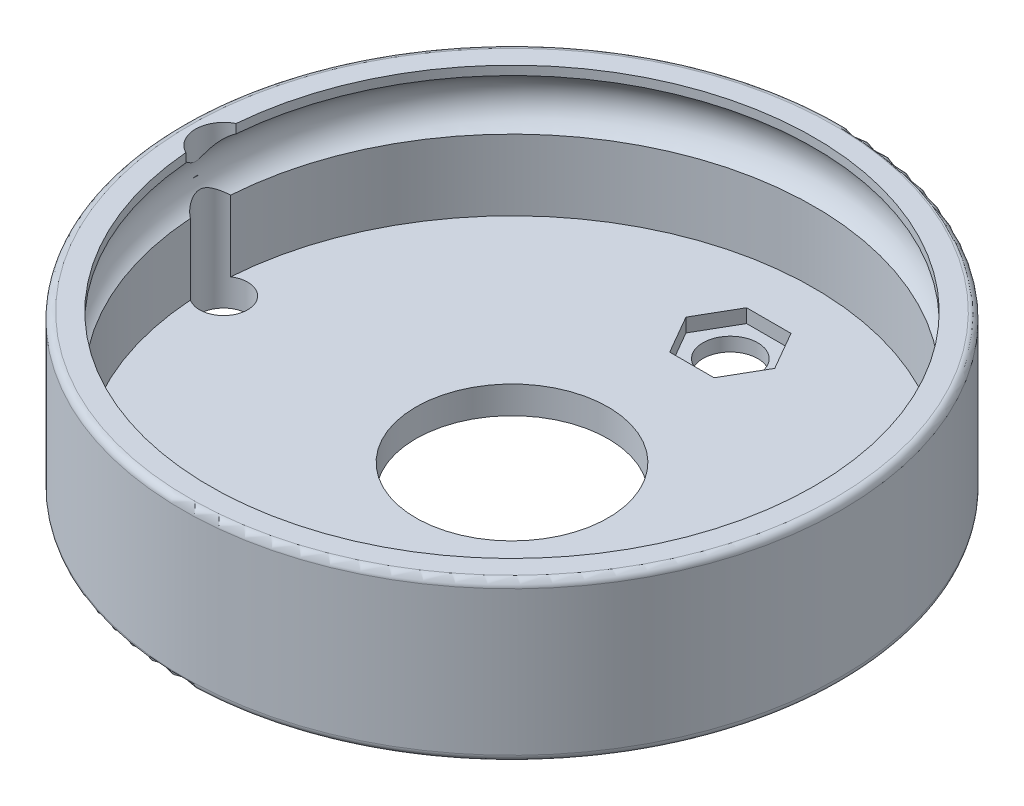
ISO-10303-21;
HEADER;
FILE_DESCRIPTION(('STEP AP214'),'2;1');
FILE_NAME('part.step','',(''),(''),'','','');
FILE_SCHEMA(('AUTOMOTIVE_DESIGN { 1 0 10303 214 1 1 1 1 }'));
ENDSEC;
DATA;
#1=APPLICATION_CONTEXT('core data for automotive mechanical design processes');
#2=APPLICATION_PROTOCOL_DEFINITION('international standard','automotive_design',2000,#1);
#3=PRODUCT_CONTEXT('',#1,'mechanical');
#4=PRODUCT('Part','Part','',(#3));
#5=PRODUCT_RELATED_PRODUCT_CATEGORY('part','',(#4));
#6=PRODUCT_DEFINITION_FORMATION('','',#4);
#7=PRODUCT_DEFINITION_CONTEXT('part definition',#1,'design');
#8=PRODUCT_DEFINITION('design','',#6,#7);
#9=PRODUCT_DEFINITION_SHAPE('','',#8);
#10=(LENGTH_UNIT() NAMED_UNIT(*) SI_UNIT(.MILLI.,.METRE.));
#11=(NAMED_UNIT(*) PLANE_ANGLE_UNIT() SI_UNIT($,.RADIAN.));
#12=(NAMED_UNIT(*) SI_UNIT($,.STERADIAN.) SOLID_ANGLE_UNIT());
#13=UNCERTAINTY_MEASURE_WITH_UNIT(LENGTH_MEASURE(1.E-05),#10,'distance_accuracy_value','');
#14=(GEOMETRIC_REPRESENTATION_CONTEXT(3) GLOBAL_UNCERTAINTY_ASSIGNED_CONTEXT((#13)) GLOBAL_UNIT_ASSIGNED_CONTEXT((#10,
#11,#12)) REPRESENTATION_CONTEXT('',''));
#15=CARTESIAN_POINT('',(0.,0.,0.));
#16=DIRECTION('',(0.,0.,1.));
#17=DIRECTION('',(1.,0.,0.));
#18=AXIS2_PLACEMENT_3D('',#15,#16,#17);
#19=CARTESIAN_POINT('',(0.,2.,0.));
#20=DIRECTION('',(0.,-1.,0.));
#21=DIRECTION('',(1.,0.,0.));
#22=AXIS2_PLACEMENT_3D('',#19,#20,#21);
#23=PLANE('',#22);
#24=CARTESIAN_POINT('',(0.,2.,0.));
#25=DIRECTION('',(0.,1.,0.));
#26=DIRECTION('',(-1.,0.,0.));
#27=AXIS2_PLACEMENT_3D('',#24,#25,#26);
#28=CIRCLE('',#27,7.);
#29=CARTESIAN_POINT('',(-7.,2.,0.));
#30=VERTEX_POINT('',#29);
#31=EDGE_CURVE('E326',#30,#30,#28,.T.);
#32=ORIENTED_EDGE('',*,*,#31,.F.);
#33=EDGE_LOOP('',(#32));
#34=FACE_BOUND('',#33,.T.);
#35=CARTESIAN_POINT('',(-21.,2.,0.));
#36=DIRECTION('',(0.,-1.,0.));
#37=DIRECTION('',(1.,0.,0.));
#38=AXIS2_PLACEMENT_3D('',#35,#36,#37);
#39=CIRCLE('',#38,1.75);
#40=CARTESIAN_POINT('',(-21.9508928571429,2.,1.46911632426934));
#41=VERTEX_POINT('',#40);
#42=CARTESIAN_POINT('',(-21.9508928571429,2.,-1.46911632426934));
#43=VERTEX_POINT('',#42);
#44=EDGE_CURVE('E263',#41,#43,#39,.F.);
#45=ORIENTED_EDGE('',*,*,#44,.F.);
#46=CARTESIAN_POINT('',(0.,2.,0.));
#47=DIRECTION('',(0.,1.,0.));
#48=DIRECTION('',(-1.,0.,0.));
#49=AXIS2_PLACEMENT_3D('',#46,#47,#48);
#50=CIRCLE('',#49,22.);
#51=EDGE_CURVE('E329',#41,#43,#50,.T.);
#52=ORIENTED_EDGE('',*,*,#51,.T.);
#53=EDGE_LOOP('',(#45,#52));
#54=FACE_BOUND('',#53,.T.);
#55=DIRECTION('',(-1.,0.,0.));
#56=VECTOR('',#55,1.);
#57=CARTESIAN_POINT('',(2.01658075373095,2.,12.7));
#58=LINE('',#57,#56);
#59=CARTESIAN_POINT('',(2.01658075373095,2.,12.7));
#60=VERTEX_POINT('',#59);
#61=CARTESIAN_POINT('',(-1.21658075373095,2.,12.7));
#62=VERTEX_POINT('',#61);
#63=EDGE_CURVE('E241',#60,#62,#58,.T.);
#64=ORIENTED_EDGE('',*,*,#63,.F.);
#65=DIRECTION('',(-0.500000000000001,0.,-0.866025403784438));
#66=VECTOR('',#65,1.);
#67=CARTESIAN_POINT('',(3.6331615074619,2.,15.5));
#68=LINE('',#67,#66);
#69=CARTESIAN_POINT('',(3.6331615074619,2.,15.5));
#70=VERTEX_POINT('',#69);
#71=EDGE_CURVE('E61',#70,#60,#68,.T.);
#72=ORIENTED_EDGE('',*,*,#71,.F.);
#73=DIRECTION('',(0.499999999999999,0.,-0.866025403784439));
#74=VECTOR('',#73,1.);
#75=CARTESIAN_POINT('',(2.01658075373095,2.,18.3));
#76=LINE('',#75,#74);
#77=CARTESIAN_POINT('',(2.01658075373095,2.,18.3));
#78=VERTEX_POINT('',#77);
#79=EDGE_CURVE('E228',#78,#70,#76,.T.);
#80=ORIENTED_EDGE('',*,*,#79,.F.);
#81=DIRECTION('',(1.,0.,0.));
#82=VECTOR('',#81,1.);
#83=CARTESIAN_POINT('',(-1.21658075373095,2.,18.3));
#84=LINE('',#83,#82);
#85=CARTESIAN_POINT('',(-1.21658075373095,2.,18.3));
#86=VERTEX_POINT('',#85);
#87=EDGE_CURVE('E231',#86,#78,#84,.T.);
#88=ORIENTED_EDGE('',*,*,#87,.F.);
#89=DIRECTION('',(0.5,0.,0.866025403784439));
#90=VECTOR('',#89,1.);
#91=CARTESIAN_POINT('',(-2.8331615074619,2.,15.5));
#92=LINE('',#91,#90);
#93=CARTESIAN_POINT('',(-2.8331615074619,2.,15.5));
#94=VERTEX_POINT('',#93);
#95=EDGE_CURVE('E235',#94,#86,#92,.T.);
#96=ORIENTED_EDGE('',*,*,#95,.F.);
#97=DIRECTION('',(-0.5,0.,0.866025403784439));
#98=VECTOR('',#97,1.);
#99=CARTESIAN_POINT('',(-1.21658075373095,2.,12.7));
#100=LINE('',#99,#98);
#101=EDGE_CURVE('E238',#62,#94,#100,.T.);
#102=ORIENTED_EDGE('',*,*,#101,.F.);
#103=EDGE_LOOP('',(#64,#72,#80,#88,#96,#102));
#104=FACE_BOUND('',#103,.T.);
#105=DIRECTION('',(0.5,0.,-0.866025403784439));
#106=VECTOR('',#105,1.);
#107=CARTESIAN_POINT('',(-8.83656800992583,2.,-5.10179491924311));
#108=LINE('',#107,#106);
#109=CARTESIAN_POINT('',(-2.8331615074619,2.,-15.5));
#110=VERTEX_POINT('',#109);
#111=CARTESIAN_POINT('',(-1.21658075373096,2.,-18.3));
#112=VERTEX_POINT('',#111);
#113=EDGE_CURVE('E53',#110,#112,#108,.T.);
#114=ORIENTED_EDGE('',*,*,#113,.T.);
#115=DIRECTION('',(1.,0.,0.));
#116=VECTOR('',#115,1.);
#117=CARTESIAN_POINT('',(0.,2.,-18.3));
#118=LINE('',#117,#116);
#119=CARTESIAN_POINT('',(2.01658075373094,2.,-18.3));
#120=VERTEX_POINT('',#119);
#121=EDGE_CURVE('E178',#112,#120,#118,.T.);
#122=ORIENTED_EDGE('',*,*,#121,.T.);
#123=DIRECTION('',(0.499999999999999,0.,0.866025403784439));
#124=VECTOR('',#123,1.);
#125=CARTESIAN_POINT('',(9.43656800992581,2.,-5.44820508075686));
#126=LINE('',#125,#124);
#127=CARTESIAN_POINT('',(3.63316150746189,2.,-15.5));
#128=VERTEX_POINT('',#127);
#129=EDGE_CURVE('E181',#120,#128,#126,.T.);
#130=ORIENTED_EDGE('',*,*,#129,.T.);
#131=DIRECTION('',(-0.5,0.,0.866025403784438));
#132=VECTOR('',#131,1.);
#133=CARTESIAN_POINT('',(-3.98682574873298,2.,-2.30179491924312));
#134=LINE('',#133,#132);
#135=CARTESIAN_POINT('',(2.01658075373095,2.,-12.7));
#136=VERTEX_POINT('',#135);
#137=EDGE_CURVE('E199',#128,#136,#134,.T.);
#138=ORIENTED_EDGE('',*,*,#137,.T.);
#139=DIRECTION('',(-1.,0.,0.));
#140=VECTOR('',#139,1.);
#141=CARTESIAN_POINT('',(0.,2.,-12.7));
#142=LINE('',#141,#140);
#143=CARTESIAN_POINT('',(-1.21658075373096,2.,-12.7));
#144=VERTEX_POINT('',#143);
#145=EDGE_CURVE('E196',#136,#144,#142,.T.);
#146=ORIENTED_EDGE('',*,*,#145,.T.);
#147=DIRECTION('',(-0.5,0.,-0.866025403784439));
#148=VECTOR('',#147,1.);
#149=CARTESIAN_POINT('',(4.58682574873297,2.,-2.64820508075688));
#150=LINE('',#149,#148);
#151=EDGE_CURVE('E194',#144,#110,#150,.T.);
#152=ORIENTED_EDGE('',*,*,#151,.T.);
#153=EDGE_LOOP('',(#114,#122,#130,#138,#146,#152));
#154=FACE_BOUND('',#153,.T.);
#155=ADVANCED_FACE('F38',(#34,#54,#104,#154),#23,.F.);
#156=CARTESIAN_POINT('',(0.,9.,0.));
#157=DIRECTION('',(0.,1.,0.));
#158=DIRECTION('',(-1.,0.,0.));
#159=AXIS2_PLACEMENT_3D('',#156,#157,#158);
#160=TOROIDAL_SURFACE('',#159,21.,2.1);
#161=CARTESIAN_POINT('',(-21.9233630002656,10.8468185312619,1.83027341393041));
#162=CARTESIAN_POINT('',(-21.9802905930155,10.8173965792043,1.80154549591476));
#163=CARTESIAN_POINT('',(-22.0350337016278,10.786129071464,1.77060499340374));
#164=CARTESIAN_POINT('',(-22.1400448430575,10.7205179132911,1.70488537685474));
#165=CARTESIAN_POINT('',(-22.1903204800144,10.6861796975606,1.67011302024804));
#166=CARTESIAN_POINT('',(-22.3340899190673,10.5796715528945,1.56112834909355));
#167=CARTESIAN_POINT('',(-22.4210962946064,10.5037021805993,1.48194995352091));
#168=CARTESIAN_POINT('',(-22.5484185919964,10.3752638251822,1.34538613057545));
#169=CARTESIAN_POINT('',(-22.5940090021654,10.3246638746398,1.29096110141001));
#170=CARTESIAN_POINT('',(-22.6787077466035,10.2217469243954,1.1787200687557));
#171=CARTESIAN_POINT('',(-22.717814159397,10.1694294211947,1.12090306693301));
#172=CARTESIAN_POINT('',(-22.7896847254728,10.0639039080598,1.00217290409094));
#173=CARTESIAN_POINT('',(-22.8224448997058,10.0106953620132,0.941257830622505));
#174=CARTESIAN_POINT('',(-22.8817112586453,9.90445677133678,0.816361907741159));
#175=CARTESIAN_POINT('',(-22.9082214409061,9.85142663411066,0.752383049636678));
#176=CARTESIAN_POINT('',(-22.9484987791132,9.76187435482978,0.639052255607793));
#177=CARTESIAN_POINT('',(-22.9637574587035,9.72487568671589,0.590601657406404));
#178=CARTESIAN_POINT('',(-22.9909917432374,9.65321248781145,0.491044655936095));
#179=CARTESIAN_POINT('',(-23.0029677789383,9.61854765122004,0.439938602171168));
#180=CARTESIAN_POINT('',(-23.020169949025,9.56460305261898,0.350410956289943));
#181=CARTESIAN_POINT('',(-23.0263350376975,9.54390791032266,0.313038353690529));
#182=CARTESIAN_POINT('',(-23.0367627938324,9.50711782183637,0.23581139547886));
#183=CARTESIAN_POINT('',(-23.0410307410837,9.49101015412112,0.195964283712251));
#184=CARTESIAN_POINT('',(-23.0462767817496,9.47060922692398,0.126666616592287));
#185=CARTESIAN_POINT('',(-23.0478685231943,9.46419041594388,0.0979155943241878));
#186=CARTESIAN_POINT('',(-23.0498198947946,9.45627963759212,0.0397421577159311));
#187=CARTESIAN_POINT('',(-23.0501831138601,9.45477331970703,0.010321952221163));
#188=CARTESIAN_POINT('',(-23.049640892952,9.45699132649809,-0.0483103087178413));
#189=CARTESIAN_POINT('',(-23.0487347779031,9.460718434492,-0.07752224509095));
#190=CARTESIAN_POINT('',(-23.0457535695919,9.47263734860213,-0.134998790748412));
#191=CARTESIAN_POINT('',(-23.0436747832657,9.48084325702844,-0.163260106857022));
#192=CARTESIAN_POINT('',(-23.0352056382934,9.51292383591861,-0.253898956134554));
#193=CARTESIAN_POINT('',(-23.0267029159511,9.54340697445668,-0.313620524036974));
#194=CARTESIAN_POINT('',(-23.0055704975357,9.61092980844803,-0.428519202575009));
#195=CARTESIAN_POINT('',(-22.9929083541111,9.64801996853784,-0.483656168808446));
#196=CARTESIAN_POINT('',(-22.9625640362926,9.72816850005715,-0.595350885118018));
#197=CARTESIAN_POINT('',(-22.9445534939284,9.77146678277515,-0.651649532030225));
#198=CARTESIAN_POINT('',(-22.9041500414674,9.85929100639993,-0.761673181413656));
#199=CARTESIAN_POINT('',(-22.8817533489583,9.90381797819585,-0.815395912403044));
#200=CARTESIAN_POINT('',(-22.8080659066111,10.0374370931439,-0.973066586352874));
#201=CARTESIAN_POINT('',(-22.7501931300971,10.1268048550729,-1.07382247454019));
#202=CARTESIAN_POINT('',(-22.6158151146606,10.3021909095783,-1.26711515351839));
#203=CARTESIAN_POINT('',(-22.5391715930528,10.3881785793459,-1.35958364923651));
#204=CARTESIAN_POINT('',(-22.366756748061,10.5522523471373,-1.53274774502226));
#205=CARTESIAN_POINT('',(-22.2710481918497,10.6303631392939,-1.61348051203911));
#206=CARTESIAN_POINT('',(-22.1278504297184,10.7280989308558,-1.7124770744131));
#207=CARTESIAN_POINT('',(-22.0887001824058,10.7531622668679,-1.73765445564527));
#208=CARTESIAN_POINT('',(-22.0078995258777,10.8014423122098,-1.7857344901196));
#209=CARTESIAN_POINT('',(-21.9662474292924,10.8246577501221,-1.80863557984394));
#210=CARTESIAN_POINT('',(-21.9233630002656,10.8468185312619,-1.83027341393041));
#211=B_SPLINE_CURVE_WITH_KNOTS('',3,(#161,#162,#163,#164,#165,#166,#167,#168,#169,#170,#171,
#172,#173,#174,#175,#176,#177,#178,#179,#180,#181,#182,#183,#184,#185,#186,#187,#188,#189,#190,
#191,#192,#193,#194,#195,#196,#197,#198,#199,#200,#201,#202,#203,#204,#205,#206,#207,#208,#209,
#210),.UNSPECIFIED.,.F.,.F.,(4,2,2,2,2,2,2,2,2,2,2,2,2,2,2,2,2,2,2,2,2,2,2,2,4),(0.,
0.210433453676087,0.420501575870549,0.838530643225176,1.09981772360362,1.36118209625276,
1.62270981595776,1.88406980345896,2.0724846801652,2.26087482071537,2.39017789810222,
2.51911883384929,2.60726328722764,2.6951500188056,2.78308350930926,2.87129548505103,
3.07246810450563,3.27524888184137,3.49478656680868,3.71451441121011,4.15279116734951,
4.59439928856464,5.0345768577585,5.19305785927877,5.35164697522814),.UNSPECIFIED.);
#212=CARTESIAN_POINT('',(-21.92375,10.8466185312619,1.83007812333244));
#213=VERTEX_POINT('',#212);
#214=CARTESIAN_POINT('',(-21.92375,10.8466185312619,-1.83007812333244));
#215=VERTEX_POINT('',#214);
#216=EDGE_CURVE('E306',#213,#215,#211,.T.);
#217=ORIENTED_EDGE('',*,*,#216,.F.);
#218=CARTESIAN_POINT('',(0.,10.8466185312619,0.));
#219=DIRECTION('',(0.,1.,0.));
#220=DIRECTION('',(-1.,0.,0.));
#221=AXIS2_PLACEMENT_3D('',#218,#219,#220);
#222=CIRCLE('',#221,22.);
#223=EDGE_CURVE('E317',#213,#215,#222,.T.);
#224=ORIENTED_EDGE('',*,*,#223,.T.);
#225=EDGE_LOOP('',(#217,#224));
#226=FACE_BOUND('',#225,.T.);
#227=CARTESIAN_POINT('',(-23.0385420983889,8.49979999999999,-0.216439629218027));
#228=CARTESIAN_POINT('',(-23.0417081023825,8.51160340613661,-0.186822190556957));
#229=CARTESIAN_POINT('',(-23.044286108454,8.52160098226851,-0.15619339901227));
#230=CARTESIAN_POINT('',(-23.0480802734292,8.53660054066823,-0.0938819804006893));
#231=CARTESIAN_POINT('',(-23.049304529016,8.54163220402275,-0.0622067986494039));
#232=CARTESIAN_POINT('',(-23.050252950515,8.5455119451354,0.00196899982279068));
#233=CARTESIAN_POINT('',(-23.049959771228,8.54428852543972,0.0344749156453112));
#234=CARTESIAN_POINT('',(-23.0478803078503,8.53585679721273,0.0985915571549284));
#235=CARTESIAN_POINT('',(-23.0460940403857,8.52864855532438,0.130202292806097));
#236=CARTESIAN_POINT('',(-23.0429265900018,8.51637585795821,0.170412356482081));
#237=CARTESIAN_POINT('',(-23.0421273835151,8.51330587899395,0.179728802027053));
#238=CARTESIAN_POINT('',(-23.0404173233971,8.50680992100783,0.198198068062205));
#239=CARTESIAN_POINT('',(-23.039506778443,8.50338493007581,0.207351263793174));
#240=CARTESIAN_POINT('',(-23.03854209839,8.49979999998293,0.216439629213118));
#241=B_SPLINE_CURVE_WITH_KNOTS('',3,(#227,#228,#229,#230,#231,#232,#233,#234,#235,#236,#237,
#238,#239,#240),.UNSPECIFIED.,.F.,.F.,(4,2,2,2,2,2,4),(0.,0.0963837900762367,0.19218794426013,
0.289089599533549,0.385990175789691,0.41551229305359,0.444954343313652),.UNSPECIFIED.);
#242=CARTESIAN_POINT('',(-23.0385959006752,8.5,-0.215932289735066));
#243=VERTEX_POINT('',#242);
#244=CARTESIAN_POINT('',(-23.0385959006752,8.5,0.215932289735066));
#245=VERTEX_POINT('',#244);
#246=EDGE_CURVE('E311',#243,#245,#241,.T.);
#247=ORIENTED_EDGE('',*,*,#246,.F.);
#248=CARTESIAN_POINT('',(0.,8.5,0.));
#249=DIRECTION('',(0.,1.,0.));
#250=DIRECTION('',(-1.,0.,0.));
#251=AXIS2_PLACEMENT_3D('',#248,#249,#250);
#252=CIRCLE('',#251,23.0396078054371);
#253=EDGE_CURVE('E11',#243,#245,#252,.T.);
#254=ORIENTED_EDGE('',*,*,#253,.T.);
#255=EDGE_LOOP('',(#247,#254));
#256=FACE_BOUND('',#255,.T.);
#257=CARTESIAN_POINT('',(0.,7.15338146873806,0.));
#258=DIRECTION('',(0.,1.,0.));
#259=DIRECTION('',(-1.,0.,0.));
#260=AXIS2_PLACEMENT_3D('',#257,#258,#259);
#261=CIRCLE('',#260,22.);
#262=CARTESIAN_POINT('',(-21.9508928571429,7.15338146873806,1.46911632426935));
#263=VERTEX_POINT('',#262);
#264=CARTESIAN_POINT('',(-21.9508928571429,7.15338146873806,-1.46911632426936));
#265=VERTEX_POINT('',#264);
#266=EDGE_CURVE('E332',#263,#265,#261,.T.);
#267=ORIENTED_EDGE('',*,*,#266,.F.);
#268=CARTESIAN_POINT('',(-21.6852629879099,7.03657806675995,1.61025297310727));
#269=CARTESIAN_POINT('',(-21.7322227360092,7.05378503974938,1.59026605983212));
#270=CARTESIAN_POINT('',(-21.7778660342877,7.07225370096692,1.56841887729176));
#271=CARTESIAN_POINT('',(-21.8663126193497,7.11126250165387,1.52135078401042));
#272=CARTESIAN_POINT('',(-21.9091216492499,7.13179822549066,1.49613702877458));
#273=CARTESIAN_POINT('',(-22.0426961951101,7.20081626722394,1.40973138283353));
#274=CARTESIAN_POINT('',(-22.1278158387662,7.25265689039355,1.34237170819555));
#275=CARTESIAN_POINT('',(-22.2835237733971,7.36044643245431,1.19444560110274));
#276=CARTESIAN_POINT('',(-22.3540260105094,7.41641718855257,1.1138057099599));
#277=CARTESIAN_POINT('',(-22.4482125341289,7.4994775174254,0.983889597282091));
#278=CARTESIAN_POINT('',(-22.4777082257626,7.52704704085949,0.93903318825795));
#279=CARTESIAN_POINT('',(-22.5327307764518,7.58108254591007,0.846255868942823));
#280=CARTESIAN_POINT('',(-22.5582557366805,7.60754799515184,0.798333507860034));
#281=CARTESIAN_POINT('',(-22.6049886586016,7.65819724200511,0.699626764281206));
#282=CARTESIAN_POINT('',(-22.6262179452373,7.68239197386449,0.648858201557964));
#283=CARTESIAN_POINT('',(-22.6641546000458,7.72727885687801,0.544225417408166));
#284=CARTESIAN_POINT('',(-22.6808679228295,7.74797560673612,0.490365387105524));
#285=CARTESIAN_POINT('',(-22.7098351753462,7.7848781722514,0.377469205073467));
#286=CARTESIAN_POINT('',(-22.7218942362695,7.80088209376438,0.318313895965427));
#287=CARTESIAN_POINT('',(-22.7398741902099,7.82511617492679,0.197592522727287));
#288=CARTESIAN_POINT('',(-22.7458098705188,7.83336505784625,0.136032640635567));
#289=CARTESIAN_POINT('',(-22.7510713027194,7.8406631393095,0.0116904333694072));
#290=CARTESIAN_POINT('',(-22.7503585618898,7.83965876418114,-0.0510969077076101));
#291=CARTESIAN_POINT('',(-22.7423016186504,7.82852131839549,-0.175453094353484));
#292=CARTESIAN_POINT('',(-22.7349475240028,7.8183746303957,-0.237019982225484));
#293=CARTESIAN_POINT('',(-22.7113948584838,7.78695234362383,-0.373719998655487));
#294=CARTESIAN_POINT('',(-22.6933349070776,7.76340064194923,-0.447989132816512));
#295=CARTESIAN_POINT('',(-22.6488576228345,7.70874868294878,-0.591120725345172));
#296=CARTESIAN_POINT('',(-22.6224110329418,7.67762209015054,-0.659963186708978));
#297=CARTESIAN_POINT('',(-22.5472125936172,7.59497251083096,-0.824889736175925));
#298=CARTESIAN_POINT('',(-22.4938954011259,7.54096845540915,-0.917636108890399));
#299=CARTESIAN_POINT('',(-22.3721622074226,7.43148808663654,-1.09127251775508));
#300=CARTESIAN_POINT('',(-22.3037685966336,7.37601406275255,-1.17217984301586));
#301=CARTESIAN_POINT('',(-22.1862358192794,7.29255137435599,-1.28793473147685));
#302=CARTESIAN_POINT('',(-22.142198556918,7.26338366871421,-1.32717800021164));
#303=CARTESIAN_POINT('',(-22.0496684334007,7.20678804736724,-1.40150650056109));
#304=CARTESIAN_POINT('',(-22.001174135829,7.17936069739284,-1.43659038328575));
#305=CARTESIAN_POINT('',(-21.8803037669477,7.11690953222264,-1.51477915118743));
#306=CARTESIAN_POINT('',(-21.805928338998,7.08303358346247,-1.55576186103222));
#307=CARTESIAN_POINT('',(-21.6496763848512,7.02225745180524,-1.62719509841536));
#308=CARTESIAN_POINT('',(-21.5678134219198,6.99534498086434,-1.65766421083391));
#309=CARTESIAN_POINT('',(-21.444817431575,6.96288757839631,-1.692993358418));
#310=CARTESIAN_POINT('',(-21.4059827435281,6.95372090007902,-1.70273166974117));
#311=CARTESIAN_POINT('',(-21.3273274142868,6.93740168116284,-1.71958570503587));
#312=CARTESIAN_POINT('',(-21.2875065877111,6.93024952244279,-1.72670093184587));
#313=CARTESIAN_POINT('',(-21.247294943628,6.92418718934002,-1.73243909297153));
#314=B_SPLINE_CURVE_WITH_KNOTS('',3,(#268,#269,#270,#271,#272,#273,#274,#275,#276,#277,#278,
#279,#280,#281,#282,#283,#284,#285,#286,#287,#288,#289,#290,#291,#292,#293,#294,#295,#296,#297,
#298,#299,#300,#301,#302,#303,#304,#305,#306,#307,#308,#309,#310,#311,#312,#313),.UNSPECIFIED.,
.F.,.F.,(4,2,2,2,2,2,2,2,2,2,2,2,2,2,2,2,2,2,2,2,2,2,4),(0.,0.161423148553828,0.322508504273242,
0.681353435789108,1.04225442118642,1.22313292260146,1.40409765701977,1.5841407133906,
1.76394519902412,1.95062232965271,2.13684759267724,2.32415172030712,2.51173529675811,
2.75033263536894,2.98977165848182,3.34746442727842,3.7046295129126,3.9017759383089,
4.09898612446107,4.3722254718327,4.64497930959451,4.76807181472212,4.8911876379828),.UNSPECIFIED.);
#315=EDGE_CURVE('E269',#263,#265,#314,.T.);
#316=ORIENTED_EDGE('',*,*,#315,.T.);
#317=EDGE_LOOP('',(#267,#316));
#318=FACE_BOUND('',#317,.T.);
#319=ADVANCED_FACE('F280',(#226,#256,#318),#160,.F.);
#320=CARTESIAN_POINT('',(0.,2.,0.));
#321=DIRECTION('',(0.,1.,0.));
#322=DIRECTION('',(-1.,0.,0.));
#323=AXIS2_PLACEMENT_3D('',#320,#321,#322);
#324=CYLINDRICAL_SURFACE('',#323,22.);
#325=DIRECTION('',(0.,-1.,0.));
#326=VECTOR('',#325,1.);
#327=CARTESIAN_POINT('',(-21.9508928571429,4.,1.46911632426935));
#328=LINE('',#327,#326);
#329=EDGE_CURVE('E267',#263,#41,#328,.T.);
#330=ORIENTED_EDGE('',*,*,#329,.F.);
#331=ORIENTED_EDGE('',*,*,#266,.T.);
#332=DIRECTION('',(0.,-1.,0.));
#333=VECTOR('',#332,1.);
#334=CARTESIAN_POINT('',(-21.9508928571429,4.,-1.46911632426935));
#335=LINE('',#334,#333);
#336=EDGE_CURVE('E265',#43,#265,#335,.F.);
#337=ORIENTED_EDGE('',*,*,#336,.F.);
#338=ORIENTED_EDGE('',*,*,#51,.F.);
#339=EDGE_LOOP('',(#330,#331,#337,#338));
#340=FACE_BOUND('',#339,.T.);
#341=ADVANCED_FACE('F362',(#340),#324,.F.);
#342=CARTESIAN_POINT('',(0.,2.,0.));
#343=DIRECTION('',(0.,1.,0.));
#344=DIRECTION('',(-1.,0.,0.));
#345=AXIS2_PLACEMENT_3D('',#342,#343,#344);
#346=CYLINDRICAL_SURFACE('',#345,7.);
#347=CARTESIAN_POINT('',(0.,0.,0.));
#348=DIRECTION('',(0.,1.,0.));
#349=DIRECTION('',(-1.,0.,0.));
#350=AXIS2_PLACEMENT_3D('',#347,#348,#349);
#351=CIRCLE('',#350,7.);
#352=CARTESIAN_POINT('',(-7.,0.,0.));
#353=VERTEX_POINT('',#352);
#354=EDGE_CURVE('E323',#353,#353,#351,.T.);
#355=ORIENTED_EDGE('',*,*,#354,.F.);
#356=EDGE_LOOP('',(#355));
#357=FACE_BOUND('',#356,.T.);
#358=ORIENTED_EDGE('',*,*,#31,.T.);
#359=EDGE_LOOP('',(#358));
#360=FACE_BOUND('',#359,.T.);
#361=ADVANCED_FACE('F576',(#357,#360),#346,.F.);
#362=CARTESIAN_POINT('',(0.,0.,0.));
#363=DIRECTION('',(0.,1.,0.));
#364=DIRECTION('',(-1.,0.,0.));
#365=AXIS2_PLACEMENT_3D('',#362,#363,#364);
#366=PLANE('',#365);
#367=CARTESIAN_POINT('',(0.399999999999992,0.,-15.5));
#368=DIRECTION('',(0.,1.,0.));
#369=DIRECTION('',(0.,0.,1.));
#370=AXIS2_PLACEMENT_3D('',#367,#368,#369);
#371=CIRCLE('',#370,2.);
#372=CARTESIAN_POINT('',(0.399999999999992,0.,-13.5));
#373=VERTEX_POINT('',#372);
#374=EDGE_CURVE('E227',#373,#373,#371,.T.);
#375=ORIENTED_EDGE('',*,*,#374,.T.);
#376=EDGE_LOOP('',(#375));
#377=FACE_BOUND('',#376,.T.);
#378=CARTESIAN_POINT('',(0.399999999999992,0.,15.5));
#379=DIRECTION('',(0.,1.,0.));
#380=DIRECTION('',(0.,0.,1.));
#381=AXIS2_PLACEMENT_3D('',#378,#379,#380);
#382=CIRCLE('',#381,2.);
#383=CARTESIAN_POINT('',(0.399999999999992,0.,17.5));
#384=VERTEX_POINT('',#383);
#385=EDGE_CURVE('E450',#384,#384,#382,.T.);
#386=ORIENTED_EDGE('',*,*,#385,.T.);
#387=EDGE_LOOP('',(#386));
#388=FACE_BOUND('',#387,.T.);
#389=CARTESIAN_POINT('',(-21.,0.,0.));
#390=DIRECTION('',(0.,1.,0.));
#391=DIRECTION('',(-1.,0.,0.));
#392=AXIS2_PLACEMENT_3D('',#389,#390,#391);
#393=CIRCLE('',#392,1.75);
#394=CARTESIAN_POINT('',(-22.75,0.,0.));
#395=VERTEX_POINT('',#394);
#396=EDGE_CURVE('E206',#395,#395,#393,.T.);
#397=ORIENTED_EDGE('',*,*,#396,.T.);
#398=EDGE_LOOP('',(#397));
#399=FACE_BOUND('',#398,.T.);
#400=CARTESIAN_POINT('',(0.,0.,0.));
#401=DIRECTION('',(0.,1.,0.));
#402=DIRECTION('',(-1.,0.,0.));
#403=AXIS2_PLACEMENT_3D('',#400,#401,#402);
#404=CIRCLE('',#403,23.5);
#405=CARTESIAN_POINT('',(-23.5,0.,0.));
#406=VERTEX_POINT('',#405);
#407=EDGE_CURVE('E341',#406,#406,#404,.F.);
#408=ORIENTED_EDGE('',*,*,#407,.T.);
#409=EDGE_LOOP('',(#408));
#410=FACE_BOUND('',#409,.T.);
#411=ORIENTED_EDGE('',*,*,#354,.T.);
#412=EDGE_LOOP('',(#411));
#413=FACE_BOUND('',#412,.T.);
#414=ADVANCED_FACE('F461',(#377,#388,#399,#410,#413),#366,.F.);
#415=CARTESIAN_POINT('',(0.,2.,0.));
#416=DIRECTION('',(0.,1.,0.));
#417=DIRECTION('',(-1.,0.,0.));
#418=AXIS2_PLACEMENT_3D('',#415,#416,#417);
#419=CYLINDRICAL_SURFACE('',#418,24.);
#420=CARTESIAN_POINT('',(0.,0.499999999999999,0.));
#421=DIRECTION('',(0.,1.,0.));
#422=DIRECTION('',(-1.,0.,0.));
#423=AXIS2_PLACEMENT_3D('',#420,#421,#422);
#424=CIRCLE('',#423,24.);
#425=CARTESIAN_POINT('',(-24.,0.499999999999999,0.));
#426=VERTEX_POINT('',#425);
#427=EDGE_CURVE('E338',#426,#426,#424,.T.);
#428=ORIENTED_EDGE('',*,*,#427,.T.);
#429=EDGE_LOOP('',(#428));
#430=FACE_BOUND('',#429,.T.);
#431=CARTESIAN_POINT('',(0.,11.,0.));
#432=DIRECTION('',(0.,-1.,0.));
#433=DIRECTION('',(1.,0.,0.));
#434=AXIS2_PLACEMENT_3D('',#431,#432,#433);
#435=CIRCLE('',#434,24.);
#436=CARTESIAN_POINT('',(24.,11.,0.));
#437=VERTEX_POINT('',#436);
#438=EDGE_CURVE('E335',#437,#437,#435,.T.);
#439=ORIENTED_EDGE('',*,*,#438,.T.);
#440=EDGE_LOOP('',(#439));
#441=FACE_BOUND('',#440,.T.);
#442=ADVANCED_FACE('F620',(#430,#441),#419,.T.);
#443=CARTESIAN_POINT('',(0.,11.5,0.));
#444=DIRECTION('',(0.,-1.,0.));
#445=DIRECTION('',(1.,0.,0.));
#446=AXIS2_PLACEMENT_3D('',#443,#444,#445);
#447=PLANE('',#446);
#448=CARTESIAN_POINT('',(0.,11.5,0.));
#449=DIRECTION('',(0.,-1.,0.));
#450=DIRECTION('',(1.,0.,0.));
#451=AXIS2_PLACEMENT_3D('',#448,#449,#450);
#452=CIRCLE('',#451,23.5);
#453=CARTESIAN_POINT('',(23.5,11.5,0.));
#454=VERTEX_POINT('',#453);
#455=EDGE_CURVE('E344',#454,#454,#452,.F.);
#456=ORIENTED_EDGE('',*,*,#455,.T.);
#457=EDGE_LOOP('',(#456));
#458=FACE_BOUND('',#457,.T.);
#459=CARTESIAN_POINT('',(0.,11.5,0.));
#460=DIRECTION('',(0.,1.,0.));
#461=DIRECTION('',(-1.,0.,0.));
#462=AXIS2_PLACEMENT_3D('',#459,#460,#461);
#463=CIRCLE('',#462,22.);
#464=CARTESIAN_POINT('',(-21.92375,11.5,1.83007812333244));
#465=VERTEX_POINT('',#464);
#466=CARTESIAN_POINT('',(-21.92375,11.5,-1.83007812333244));
#467=VERTEX_POINT('',#466);
#468=EDGE_CURVE('E320',#465,#467,#463,.T.);
#469=ORIENTED_EDGE('',*,*,#468,.F.);
#470=CARTESIAN_POINT('',(-21.,11.5,0.));
#471=DIRECTION('',(0.,1.,0.));
#472=DIRECTION('',(-1.,0.,0.));
#473=AXIS2_PLACEMENT_3D('',#470,#471,#472);
#474=CIRCLE('',#473,2.05);
#475=EDGE_CURVE('E277',#467,#465,#474,.T.);
#476=ORIENTED_EDGE('',*,*,#475,.F.);
#477=EDGE_LOOP('',(#469,#476));
#478=FACE_BOUND('',#477,.T.);
#479=ADVANCED_FACE('F357',(#458,#478),#447,.F.);
#480=ORIENTED_EDGE('',*,*,#223,.F.);
#481=DIRECTION('',(0.,1.,0.));
#482=VECTOR('',#481,1.);
#483=CARTESIAN_POINT('',(-21.92375,10.,1.83007812333244));
#484=LINE('',#483,#482);
#485=EDGE_CURVE('E46',#213,#465,#484,.T.);
#486=ORIENTED_EDGE('',*,*,#485,.T.);
#487=ORIENTED_EDGE('',*,*,#468,.T.);
#488=DIRECTION('',(0.,1.,0.));
#489=VECTOR('',#488,1.);
#490=CARTESIAN_POINT('',(-21.92375,10.,-1.83007812333244));
#491=LINE('',#490,#489);
#492=EDGE_CURVE('E347',#467,#215,#491,.F.);
#493=ORIENTED_EDGE('',*,*,#492,.T.);
#494=EDGE_LOOP('',(#480,#486,#487,#493));
#495=FACE_BOUND('',#494,.T.);
#496=ADVANCED_FACE('F302',(#495),#324,.F.);
#497=CARTESIAN_POINT('',(0.,0.5,0.));
#498=DIRECTION('',(0.,1.,0.));
#499=DIRECTION('',(-1.,0.,0.));
#500=AXIS2_PLACEMENT_3D('',#497,#498,#499);
#501=TOROIDAL_SURFACE('',#500,23.5,0.5);
#502=ORIENTED_EDGE('',*,*,#407,.F.);
#503=EDGE_LOOP('',(#502));
#504=FACE_BOUND('',#503,.T.);
#505=ORIENTED_EDGE('',*,*,#427,.F.);
#506=EDGE_LOOP('',(#505));
#507=FACE_BOUND('',#506,.T.);
#508=ADVANCED_FACE('F599',(#504,#507),#501,.T.);
#509=CARTESIAN_POINT('',(0.,11.,0.));
#510=DIRECTION('',(0.,-1.,0.));
#511=DIRECTION('',(1.,0.,0.));
#512=AXIS2_PLACEMENT_3D('',#509,#510,#511);
#513=TOROIDAL_SURFACE('',#512,23.5,0.5);
#514=ORIENTED_EDGE('',*,*,#438,.F.);
#515=EDGE_LOOP('',(#514));
#516=FACE_BOUND('',#515,.T.);
#517=ORIENTED_EDGE('',*,*,#455,.F.);
#518=EDGE_LOOP('',(#517));
#519=FACE_BOUND('',#518,.T.);
#520=ADVANCED_FACE('F40',(#516,#519),#513,.T.);
#521=CARTESIAN_POINT('',(-21.,8.5,0.));
#522=DIRECTION('',(0.,1.,0.));
#523=DIRECTION('',(-1.,0.,0.));
#524=AXIS2_PLACEMENT_3D('',#521,#522,#523);
#525=CYLINDRICAL_SURFACE('',#524,2.05);
#526=ORIENTED_EDGE('',*,*,#216,.T.);
#527=ORIENTED_EDGE('',*,*,#492,.F.);
#528=ORIENTED_EDGE('',*,*,#475,.T.);
#529=ORIENTED_EDGE('',*,*,#485,.F.);
#530=EDGE_LOOP('',(#526,#527,#528,#529));
#531=FACE_BOUND('',#530,.T.);
#532=ADVANCED_FACE('F300',(#531),#525,.F.);
#533=ORIENTED_EDGE('',*,*,#246,.T.);
#534=CARTESIAN_POINT('',(-21.,8.5,0.));
#535=DIRECTION('',(0.,1.,0.));
#536=DIRECTION('',(-1.,0.,0.));
#537=AXIS2_PLACEMENT_3D('',#534,#535,#536);
#538=CIRCLE('',#537,2.05);
#539=EDGE_CURVE('E278',#243,#245,#538,.T.);
#540=ORIENTED_EDGE('',*,*,#539,.F.);
#541=EDGE_LOOP('',(#533,#540));
#542=FACE_BOUND('',#541,.T.);
#543=ADVANCED_FACE('F295',(#542),#525,.F.);
#544=CARTESIAN_POINT('',(-21.,8.5,0.));
#545=DIRECTION('',(0.,1.,0.));
#546=DIRECTION('',(-1.,0.,0.));
#547=AXIS2_PLACEMENT_3D('',#544,#545,#546);
#548=PLANE('',#547);
#549=ORIENTED_EDGE('',*,*,#539,.T.);
#550=ORIENTED_EDGE('',*,*,#253,.F.);
#551=EDGE_LOOP('',(#549,#550));
#552=FACE_BOUND('',#551,.T.);
#553=ADVANCED_FACE('F289',(#552),#548,.T.);
#554=CARTESIAN_POINT('',(-21.,8.,0.));
#555=DIRECTION('',(0.,-1.,0.));
#556=DIRECTION('',(1.,0.,0.));
#557=AXIS2_PLACEMENT_3D('',#554,#555,#556);
#558=CYLINDRICAL_SURFACE('',#557,1.75);
#559=ORIENTED_EDGE('',*,*,#329,.T.);
#560=ORIENTED_EDGE('',*,*,#44,.T.);
#561=ORIENTED_EDGE('',*,*,#336,.T.);
#562=ORIENTED_EDGE('',*,*,#315,.F.);
#563=EDGE_LOOP('',(#559,#560,#561,#562));
#564=FACE_BOUND('',#563,.T.);
#565=ORIENTED_EDGE('',*,*,#396,.F.);
#566=EDGE_LOOP('',(#565));
#567=FACE_BOUND('',#566,.T.);
#568=ADVANCED_FACE('F283',(#564,#567),#558,.F.);
#569=CARTESIAN_POINT('',(3.6331615074619,0.999999999999999,15.5));
#570=DIRECTION('',(0.866025403784438,0.,-0.500000000000001));
#571=DIRECTION('',(-0.500000000000001,0.,-0.866025403784438));
#572=AXIS2_PLACEMENT_3D('',#569,#570,#571);
#573=PLANE('',#572);
#574=ORIENTED_EDGE('',*,*,#71,.T.);
#575=DIRECTION('',(0.,1.,0.));
#576=VECTOR('',#575,1.);
#577=CARTESIAN_POINT('',(2.01658075373095,0.999999999999999,12.7));
#578=LINE('',#577,#576);
#579=CARTESIAN_POINT('',(2.01658075373095,0.999999999999999,12.7));
#580=VERTEX_POINT('',#579);
#581=EDGE_CURVE('E214',#580,#60,#578,.T.);
#582=ORIENTED_EDGE('',*,*,#581,.F.);
#583=DIRECTION('',(-0.500000000000001,0.,-0.866025403784438));
#584=VECTOR('',#583,1.);
#585=CARTESIAN_POINT('',(3.6331615074619,0.999999999999999,15.5));
#586=LINE('',#585,#584);
#587=CARTESIAN_POINT('',(3.6331615074619,0.999999999999999,15.5));
#588=VERTEX_POINT('',#587);
#589=EDGE_CURVE('E232',#588,#580,#586,.T.);
#590=ORIENTED_EDGE('',*,*,#589,.F.);
#591=DIRECTION('',(0.,1.,0.));
#592=VECTOR('',#591,1.);
#593=CARTESIAN_POINT('',(3.6331615074619,0.999999999999999,15.5));
#594=LINE('',#593,#592);
#595=EDGE_CURVE('E225',#588,#70,#594,.T.);
#596=ORIENTED_EDGE('',*,*,#595,.T.);
#597=EDGE_LOOP('',(#574,#582,#590,#596));
#598=FACE_BOUND('',#597,.T.);
#599=ADVANCED_FACE('F288',(#598),#573,.F.);
#600=CARTESIAN_POINT('',(2.01658075373095,0.999999999999999,18.3));
#601=DIRECTION('',(0.866025403784439,0.,0.499999999999999));
#602=DIRECTION('',(0.499999999999999,0.,-0.866025403784439));
#603=AXIS2_PLACEMENT_3D('',#600,#601,#602);
#604=PLANE('',#603);
#605=ORIENTED_EDGE('',*,*,#79,.T.);
#606=ORIENTED_EDGE('',*,*,#595,.F.);
#607=DIRECTION('',(0.499999999999999,0.,-0.866025403784439));
#608=VECTOR('',#607,1.);
#609=CARTESIAN_POINT('',(2.01658075373095,0.999999999999999,18.3));
#610=LINE('',#609,#608);
#611=CARTESIAN_POINT('',(2.01658075373095,0.999999999999999,18.3));
#612=VERTEX_POINT('',#611);
#613=EDGE_CURVE('E216',#612,#588,#610,.T.);
#614=ORIENTED_EDGE('',*,*,#613,.F.);
#615=DIRECTION('',(0.,1.,0.));
#616=VECTOR('',#615,1.);
#617=CARTESIAN_POINT('',(2.01658075373095,0.999999999999999,18.3));
#618=LINE('',#617,#616);
#619=EDGE_CURVE('E223',#612,#78,#618,.T.);
#620=ORIENTED_EDGE('',*,*,#619,.T.);
#621=EDGE_LOOP('',(#605,#606,#614,#620));
#622=FACE_BOUND('',#621,.T.);
#623=ADVANCED_FACE('F413',(#622),#604,.F.);
#624=CARTESIAN_POINT('',(-1.21658075373095,0.999999999999999,18.3));
#625=DIRECTION('',(0.,0.,1.));
#626=DIRECTION('',(1.,0.,0.));
#627=AXIS2_PLACEMENT_3D('',#624,#625,#626);
#628=PLANE('',#627);
#629=ORIENTED_EDGE('',*,*,#87,.T.);
#630=ORIENTED_EDGE('',*,*,#619,.F.);
#631=DIRECTION('',(1.,0.,0.));
#632=VECTOR('',#631,1.);
#633=CARTESIAN_POINT('',(-1.21658075373095,0.999999999999999,18.3));
#634=LINE('',#633,#632);
#635=CARTESIAN_POINT('',(-1.21658075373095,0.999999999999999,18.3));
#636=VERTEX_POINT('',#635);
#637=EDGE_CURVE('E247',#636,#612,#634,.T.);
#638=ORIENTED_EDGE('',*,*,#637,.F.);
#639=DIRECTION('',(0.,1.,0.));
#640=VECTOR('',#639,1.);
#641=CARTESIAN_POINT('',(-1.21658075373095,0.999999999999999,18.3));
#642=LINE('',#641,#640);
#643=EDGE_CURVE('E221',#636,#86,#642,.T.);
#644=ORIENTED_EDGE('',*,*,#643,.T.);
#645=EDGE_LOOP('',(#629,#630,#638,#644));
#646=FACE_BOUND('',#645,.T.);
#647=ADVANCED_FACE('F425',(#646),#628,.F.);
#648=CARTESIAN_POINT('',(-2.8331615074619,0.999999999999999,15.5));
#649=DIRECTION('',(-0.866025403784439,0.,0.5));
#650=DIRECTION('',(0.5,0.,0.866025403784439));
#651=AXIS2_PLACEMENT_3D('',#648,#649,#650);
#652=PLANE('',#651);
#653=ORIENTED_EDGE('',*,*,#95,.T.);
#654=ORIENTED_EDGE('',*,*,#643,.F.);
#655=DIRECTION('',(0.5,0.,0.866025403784439));
#656=VECTOR('',#655,1.);
#657=CARTESIAN_POINT('',(-2.8331615074619,0.999999999999999,15.5));
#658=LINE('',#657,#656);
#659=CARTESIAN_POINT('',(-2.8331615074619,0.999999999999999,15.5));
#660=VERTEX_POINT('',#659);
#661=EDGE_CURVE('E250',#660,#636,#658,.T.);
#662=ORIENTED_EDGE('',*,*,#661,.F.);
#663=DIRECTION('',(0.,1.,0.));
#664=VECTOR('',#663,1.);
#665=CARTESIAN_POINT('',(-2.8331615074619,0.999999999999999,15.5));
#666=LINE('',#665,#664);
#667=EDGE_CURVE('E219',#660,#94,#666,.T.);
#668=ORIENTED_EDGE('',*,*,#667,.T.);
#669=EDGE_LOOP('',(#653,#654,#662,#668));
#670=FACE_BOUND('',#669,.T.);
#671=ADVANCED_FACE('F421',(#670),#652,.F.);
#672=CARTESIAN_POINT('',(-1.21658075373095,0.999999999999999,12.7));
#673=DIRECTION('',(-0.866025403784439,0.,-0.499999999999999));
#674=DIRECTION('',(-0.5,0.,0.866025403784439));
#675=AXIS2_PLACEMENT_3D('',#672,#673,#674);
#676=PLANE('',#675);
#677=ORIENTED_EDGE('',*,*,#101,.T.);
#678=ORIENTED_EDGE('',*,*,#667,.F.);
#679=DIRECTION('',(-0.5,0.,0.866025403784439));
#680=VECTOR('',#679,1.);
#681=CARTESIAN_POINT('',(-1.21658075373095,0.999999999999999,12.7));
#682=LINE('',#681,#680);
#683=CARTESIAN_POINT('',(-1.21658075373095,0.999999999999999,12.7));
#684=VERTEX_POINT('',#683);
#685=EDGE_CURVE('E253',#684,#660,#682,.T.);
#686=ORIENTED_EDGE('',*,*,#685,.F.);
#687=DIRECTION('',(0.,1.,0.));
#688=VECTOR('',#687,1.);
#689=CARTESIAN_POINT('',(-1.21658075373095,0.999999999999999,12.7));
#690=LINE('',#689,#688);
#691=EDGE_CURVE('E217',#684,#62,#690,.T.);
#692=ORIENTED_EDGE('',*,*,#691,.T.);
#693=EDGE_LOOP('',(#677,#678,#686,#692));
#694=FACE_BOUND('',#693,.T.);
#695=ADVANCED_FACE('F417',(#694),#676,.F.);
#696=CARTESIAN_POINT('',(2.01658075373095,0.999999999999999,12.7));
#697=DIRECTION('',(0.,0.,-1.));
#698=DIRECTION('',(-1.,0.,0.));
#699=AXIS2_PLACEMENT_3D('',#696,#697,#698);
#700=PLANE('',#699);
#701=ORIENTED_EDGE('',*,*,#63,.T.);
#702=ORIENTED_EDGE('',*,*,#691,.F.);
#703=DIRECTION('',(-1.,0.,0.));
#704=VECTOR('',#703,1.);
#705=CARTESIAN_POINT('',(2.01658075373095,0.999999999999999,12.7));
#706=LINE('',#705,#704);
#707=EDGE_CURVE('E256',#580,#684,#706,.T.);
#708=ORIENTED_EDGE('',*,*,#707,.F.);
#709=ORIENTED_EDGE('',*,*,#581,.T.);
#710=EDGE_LOOP('',(#701,#702,#708,#709));
#711=FACE_BOUND('',#710,.T.);
#712=ADVANCED_FACE('F414',(#711),#700,.F.);
#713=CARTESIAN_POINT('',(0.,0.999999999999999,0.));
#714=DIRECTION('',(0.,1.,0.));
#715=DIRECTION('',(0.,0.,1.));
#716=AXIS2_PLACEMENT_3D('',#713,#714,#715);
#717=PLANE('',#716);
#718=CARTESIAN_POINT('',(0.399999999999992,0.999999999999999,15.5));
#719=DIRECTION('',(0.,1.,0.));
#720=DIRECTION('',(0.,0.,1.));
#721=AXIS2_PLACEMENT_3D('',#718,#719,#720);
#722=CIRCLE('',#721,2.);
#723=CARTESIAN_POINT('',(0.399999999999992,0.999999999999999,17.5));
#724=VERTEX_POINT('',#723);
#725=EDGE_CURVE('E184',#724,#724,#722,.T.);
#726=ORIENTED_EDGE('',*,*,#725,.F.);
#727=EDGE_LOOP('',(#726));
#728=FACE_BOUND('',#727,.T.);
#729=ORIENTED_EDGE('',*,*,#589,.T.);
#730=ORIENTED_EDGE('',*,*,#707,.T.);
#731=ORIENTED_EDGE('',*,*,#685,.T.);
#732=ORIENTED_EDGE('',*,*,#661,.T.);
#733=ORIENTED_EDGE('',*,*,#637,.T.);
#734=ORIENTED_EDGE('',*,*,#613,.T.);
#735=EDGE_LOOP('',(#729,#730,#731,#732,#733,#734));
#736=FACE_BOUND('',#735,.T.);
#737=ADVANCED_FACE('F291',(#728,#736),#717,.T.);
#738=CARTESIAN_POINT('',(-8.83656800992583,0.999999999999998,-5.10179491924311));
#739=DIRECTION('',(0.866025403784439,0.,0.5));
#740=DIRECTION('',(0.5,0.,-0.866025403784439));
#741=AXIS2_PLACEMENT_3D('',#738,#739,#740);
#742=PLANE('',#741);
#743=ORIENTED_EDGE('',*,*,#113,.F.);
#744=DIRECTION('',(0.,1.,0.));
#745=VECTOR('',#744,1.);
#746=CARTESIAN_POINT('',(-2.83316150746191,0.999999999999998,-15.5));
#747=LINE('',#746,#745);
#748=CARTESIAN_POINT('',(-2.83316150746191,0.999999999999998,-15.5));
#749=VERTEX_POINT('',#748);
#750=EDGE_CURVE('E162',#749,#110,#747,.T.);
#751=ORIENTED_EDGE('',*,*,#750,.F.);
#752=DIRECTION('',(0.5,0.,-0.866025403784439));
#753=VECTOR('',#752,1.);
#754=CARTESIAN_POINT('',(-8.83656800992583,0.999999999999998,-5.10179491924311));
#755=LINE('',#754,#753);
#756=CARTESIAN_POINT('',(-1.21658075373096,0.999999999999999,-18.3));
#757=VERTEX_POINT('',#756);
#758=EDGE_CURVE('E169',#749,#757,#755,.T.);
#759=ORIENTED_EDGE('',*,*,#758,.T.);
#760=DIRECTION('',(0.,1.,0.));
#761=VECTOR('',#760,1.);
#762=CARTESIAN_POINT('',(-1.21658075373096,0.999999999999999,-18.3));
#763=LINE('',#762,#761);
#764=EDGE_CURVE('E204',#757,#112,#763,.T.);
#765=ORIENTED_EDGE('',*,*,#764,.T.);
#766=EDGE_LOOP('',(#743,#751,#759,#765));
#767=FACE_BOUND('',#766,.T.);
#768=ADVANCED_FACE('F172',(#767),#742,.T.);
#769=CARTESIAN_POINT('',(0.,0.999999999999999,-18.3));
#770=DIRECTION('',(0.,0.,1.));
#771=DIRECTION('',(1.,0.,0.));
#772=AXIS2_PLACEMENT_3D('',#769,#770,#771);
#773=PLANE('',#772);
#774=ORIENTED_EDGE('',*,*,#121,.F.);
#775=ORIENTED_EDGE('',*,*,#764,.F.);
#776=DIRECTION('',(1.,0.,0.));
#777=VECTOR('',#776,1.);
#778=CARTESIAN_POINT('',(0.,0.999999999999999,-18.3));
#779=LINE('',#778,#777);
#780=CARTESIAN_POINT('',(2.01658075373094,0.999999999999999,-18.3));
#781=VERTEX_POINT('',#780);
#782=EDGE_CURVE('E174',#757,#781,#779,.T.);
#783=ORIENTED_EDGE('',*,*,#782,.T.);
#784=DIRECTION('',(0.,1.,0.));
#785=VECTOR('',#784,1.);
#786=CARTESIAN_POINT('',(2.01658075373094,0.999999999999999,-18.3));
#787=LINE('',#786,#785);
#788=EDGE_CURVE('E207',#781,#120,#787,.T.);
#789=ORIENTED_EDGE('',*,*,#788,.T.);
#790=EDGE_LOOP('',(#774,#775,#783,#789));
#791=FACE_BOUND('',#790,.T.);
#792=ADVANCED_FACE('F393',(#791),#773,.T.);
#793=CARTESIAN_POINT('',(9.43656800992581,0.999999999999999,-5.44820508075686));
#794=DIRECTION('',(-0.866025403784439,0.,0.499999999999999));
#795=DIRECTION('',(0.499999999999999,0.,0.866025403784439));
#796=AXIS2_PLACEMENT_3D('',#793,#794,#795);
#797=PLANE('',#796);
#798=ORIENTED_EDGE('',*,*,#129,.F.);
#799=ORIENTED_EDGE('',*,*,#788,.F.);
#800=DIRECTION('',(0.499999999999999,0.,0.866025403784439));
#801=VECTOR('',#800,1.);
#802=CARTESIAN_POINT('',(9.43656800992581,0.999999999999999,-5.44820508075686));
#803=LINE('',#802,#801);
#804=CARTESIAN_POINT('',(3.63316150746189,0.999999999999999,-15.5));
#805=VERTEX_POINT('',#804);
#806=EDGE_CURVE('E190',#781,#805,#803,.T.);
#807=ORIENTED_EDGE('',*,*,#806,.T.);
#808=DIRECTION('',(0.,1.,0.));
#809=VECTOR('',#808,1.);
#810=CARTESIAN_POINT('',(3.63316150746189,0.999999999999999,-15.5));
#811=LINE('',#810,#809);
#812=EDGE_CURVE('E209',#805,#128,#811,.T.);
#813=ORIENTED_EDGE('',*,*,#812,.T.);
#814=EDGE_LOOP('',(#798,#799,#807,#813));
#815=FACE_BOUND('',#814,.T.);
#816=ADVANCED_FACE('F390',(#815),#797,.T.);
#817=CARTESIAN_POINT('',(-3.98682574873298,0.999999999999999,-2.30179491924312));
#818=DIRECTION('',(-0.866025403784438,0.,-0.5));
#819=DIRECTION('',(-0.5,0.,0.866025403784438));
#820=AXIS2_PLACEMENT_3D('',#817,#818,#819);
#821=PLANE('',#820);
#822=ORIENTED_EDGE('',*,*,#137,.F.);
#823=ORIENTED_EDGE('',*,*,#812,.F.);
#824=DIRECTION('',(-0.5,0.,0.866025403784438));
#825=VECTOR('',#824,1.);
#826=CARTESIAN_POINT('',(-3.98682574873298,0.999999999999999,-2.30179491924312));
#827=LINE('',#826,#825);
#828=CARTESIAN_POINT('',(2.01658075373095,0.999999999999999,-12.7));
#829=VERTEX_POINT('',#828);
#830=EDGE_CURVE('E188',#805,#829,#827,.T.);
#831=ORIENTED_EDGE('',*,*,#830,.T.);
#832=DIRECTION('',(0.,1.,0.));
#833=VECTOR('',#832,1.);
#834=CARTESIAN_POINT('',(2.01658075373095,0.999999999999999,-12.7));
#835=LINE('',#834,#833);
#836=EDGE_CURVE('E211',#829,#136,#835,.T.);
#837=ORIENTED_EDGE('',*,*,#836,.T.);
#838=EDGE_LOOP('',(#822,#823,#831,#837));
#839=FACE_BOUND('',#838,.T.);
#840=ADVANCED_FACE('F387',(#839),#821,.T.);
#841=CARTESIAN_POINT('',(0.,0.999999999999999,-12.7));
#842=DIRECTION('',(0.,0.,-1.));
#843=DIRECTION('',(-1.,0.,0.));
#844=AXIS2_PLACEMENT_3D('',#841,#842,#843);
#845=PLANE('',#844);
#846=ORIENTED_EDGE('',*,*,#145,.F.);
#847=ORIENTED_EDGE('',*,*,#836,.F.);
#848=DIRECTION('',(-1.,0.,0.));
#849=VECTOR('',#848,1.);
#850=CARTESIAN_POINT('',(0.,0.999999999999999,-12.7));
#851=LINE('',#850,#849);
#852=CARTESIAN_POINT('',(-1.21658075373096,0.999999999999999,-12.7));
#853=VERTEX_POINT('',#852);
#854=EDGE_CURVE('E168',#829,#853,#851,.T.);
#855=ORIENTED_EDGE('',*,*,#854,.T.);
#856=DIRECTION('',(0.,1.,0.));
#857=VECTOR('',#856,1.);
#858=CARTESIAN_POINT('',(-1.21658075373096,0.999999999999999,-12.7));
#859=LINE('',#858,#857);
#860=EDGE_CURVE('E164',#853,#144,#859,.T.);
#861=ORIENTED_EDGE('',*,*,#860,.T.);
#862=EDGE_LOOP('',(#846,#847,#855,#861));
#863=FACE_BOUND('',#862,.T.);
#864=ADVANCED_FACE('F383',(#863),#845,.T.);
#865=CARTESIAN_POINT('',(4.58682574873297,0.999999999999999,-2.64820508075688));
#866=DIRECTION('',(0.866025403784439,0.,-0.5));
#867=DIRECTION('',(-0.5,0.,-0.866025403784439));
#868=AXIS2_PLACEMENT_3D('',#865,#866,#867);
#869=PLANE('',#868);
#870=ORIENTED_EDGE('',*,*,#151,.F.);
#871=ORIENTED_EDGE('',*,*,#860,.F.);
#872=DIRECTION('',(-0.5,0.,-0.866025403784439));
#873=VECTOR('',#872,1.);
#874=CARTESIAN_POINT('',(4.58682574873297,0.999999999999999,-2.64820508075688));
#875=LINE('',#874,#873);
#876=EDGE_CURVE('E159',#853,#749,#875,.T.);
#877=ORIENTED_EDGE('',*,*,#876,.T.);
#878=ORIENTED_EDGE('',*,*,#750,.T.);
#879=EDGE_LOOP('',(#870,#871,#877,#878));
#880=FACE_BOUND('',#879,.T.);
#881=ADVANCED_FACE('F161',(#880),#869,.T.);
#882=CARTESIAN_POINT('',(0.,0.999999999999999,0.));
#883=DIRECTION('',(0.,1.,0.));
#884=DIRECTION('',(-1.,0.,0.));
#885=AXIS2_PLACEMENT_3D('',#882,#883,#884);
#886=PLANE('',#885);
#887=CARTESIAN_POINT('',(0.399999999999992,0.999999999999999,-15.5));
#888=DIRECTION('',(0.,1.,0.));
#889=DIRECTION('',(0.,0.,1.));
#890=AXIS2_PLACEMENT_3D('',#887,#888,#889);
#891=CIRCLE('',#890,2.);
#892=CARTESIAN_POINT('',(0.399999999999992,0.999999999999999,-13.5));
#893=VERTEX_POINT('',#892);
#894=EDGE_CURVE('E452',#893,#893,#891,.T.);
#895=ORIENTED_EDGE('',*,*,#894,.F.);
#896=EDGE_LOOP('',(#895));
#897=FACE_BOUND('',#896,.T.);
#898=ORIENTED_EDGE('',*,*,#758,.F.);
#899=ORIENTED_EDGE('',*,*,#876,.F.);
#900=ORIENTED_EDGE('',*,*,#854,.F.);
#901=ORIENTED_EDGE('',*,*,#830,.F.);
#902=ORIENTED_EDGE('',*,*,#806,.F.);
#903=ORIENTED_EDGE('',*,*,#782,.F.);
#904=EDGE_LOOP('',(#898,#899,#900,#901,#902,#903));
#905=FACE_BOUND('',#904,.T.);
#906=ADVANCED_FACE('F176',(#897,#905),#886,.T.);
#907=CARTESIAN_POINT('',(0.399999999999992,0.,15.5));
#908=DIRECTION('',(0.,1.,0.));
#909=DIRECTION('',(0.,0.,1.));
#910=AXIS2_PLACEMENT_3D('',#907,#908,#909);
#911=CYLINDRICAL_SURFACE('',#910,2.);
#912=ORIENTED_EDGE('',*,*,#385,.F.);
#913=EDGE_LOOP('',(#912));
#914=FACE_BOUND('',#913,.T.);
#915=ORIENTED_EDGE('',*,*,#725,.T.);
#916=EDGE_LOOP('',(#915));
#917=FACE_BOUND('',#916,.T.);
#918=ADVANCED_FACE('F466',(#914,#917),#911,.F.);
#919=CARTESIAN_POINT('',(0.399999999999992,0.,-15.5));
#920=DIRECTION('',(0.,1.,0.));
#921=DIRECTION('',(0.,0.,1.));
#922=AXIS2_PLACEMENT_3D('',#919,#920,#921);
#923=CYLINDRICAL_SURFACE('',#922,2.);
#924=ORIENTED_EDGE('',*,*,#374,.F.);
#925=EDGE_LOOP('',(#924));
#926=FACE_BOUND('',#925,.T.);
#927=ORIENTED_EDGE('',*,*,#894,.T.);
#928=EDGE_LOOP('',(#927));
#929=FACE_BOUND('',#928,.T.);
#930=ADVANCED_FACE('F463',(#926,#929),#923,.F.);
#931=CLOSED_SHELL('',(#155,#319,#341,#361,#414,#442,#479,#496,#508,#520,#532,#543,#553,#568,
#599,#623,#647,#671,#695,#712,#737,#768,#792,#816,#840,#864,#881,#906,#918,#930));
#932=MANIFOLD_SOLID_BREP('B2',#931);
#933=ADVANCED_BREP_SHAPE_REPRESENTATION('',(#18,#932),#14);
#934=SHAPE_DEFINITION_REPRESENTATION(#9,#933);
ENDSEC;
END-ISO-10303-21;
